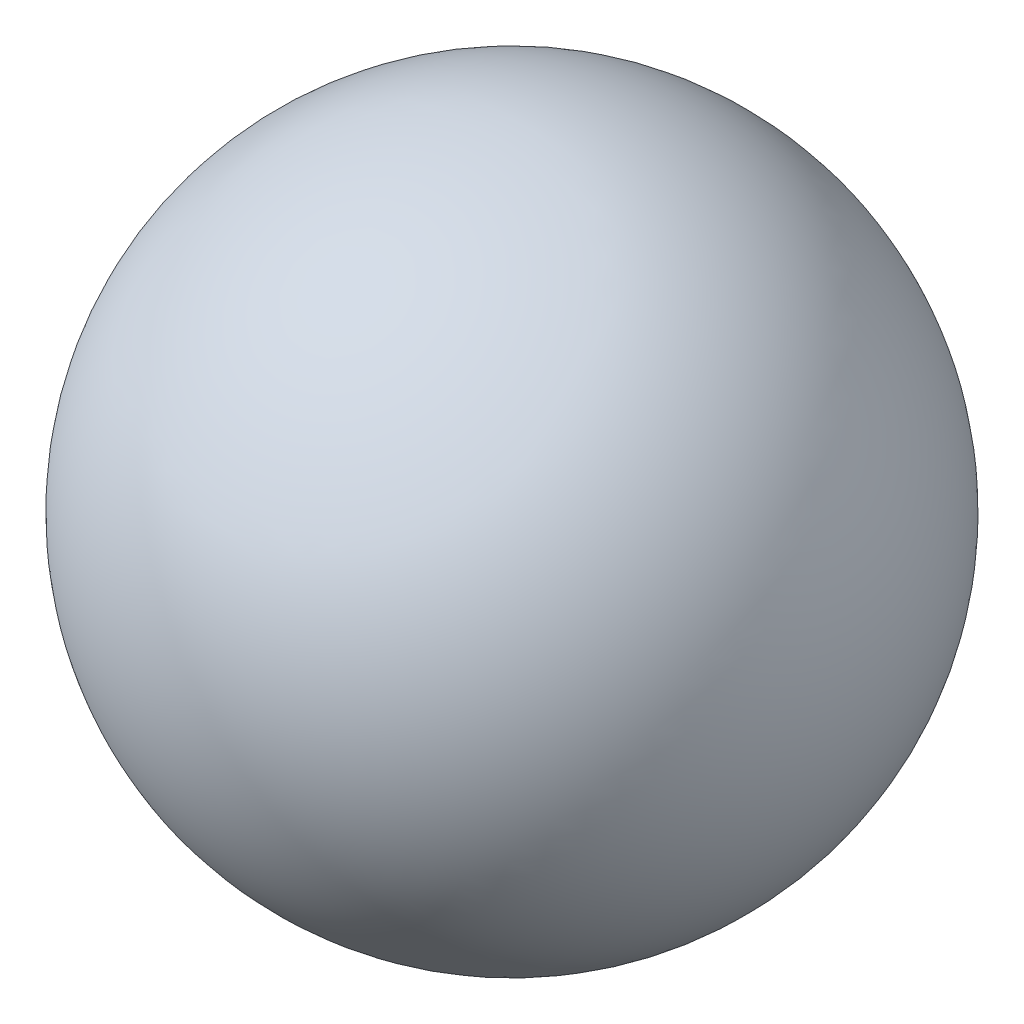
ISO-10303-21;
HEADER;
FILE_DESCRIPTION(('STEP AP214'),'2;1');
FILE_NAME('part.step','',(''),(''),'','','');
FILE_SCHEMA(('AUTOMOTIVE_DESIGN { 1 0 10303 214 1 1 1 1 }'));
ENDSEC;
DATA;
#1=APPLICATION_CONTEXT('core data for automotive mechanical design processes');
#2=APPLICATION_PROTOCOL_DEFINITION('international standard','automotive_design',2000,#1);
#3=PRODUCT_CONTEXT('',#1,'mechanical');
#4=PRODUCT('Part','Part','',(#3));
#5=PRODUCT_RELATED_PRODUCT_CATEGORY('part','',(#4));
#6=PRODUCT_DEFINITION_FORMATION('','',#4);
#7=PRODUCT_DEFINITION_CONTEXT('part definition',#1,'design');
#8=PRODUCT_DEFINITION('design','',#6,#7);
#9=PRODUCT_DEFINITION_SHAPE('','',#8);
#10=(LENGTH_UNIT() NAMED_UNIT(*) SI_UNIT(.MILLI.,.METRE.));
#11=(NAMED_UNIT(*) PLANE_ANGLE_UNIT() SI_UNIT($,.RADIAN.));
#12=(NAMED_UNIT(*) SI_UNIT($,.STERADIAN.) SOLID_ANGLE_UNIT());
#13=UNCERTAINTY_MEASURE_WITH_UNIT(LENGTH_MEASURE(1.E-05),#10,'distance_accuracy_value','');
#14=(GEOMETRIC_REPRESENTATION_CONTEXT(3) GLOBAL_UNCERTAINTY_ASSIGNED_CONTEXT((#13)) GLOBAL_UNIT_ASSIGNED_CONTEXT((#10,
#11,#12)) REPRESENTATION_CONTEXT('',''));
#15=CARTESIAN_POINT('',(0.,0.,0.));
#16=DIRECTION('',(0.,0.,1.));
#17=DIRECTION('',(1.,0.,0.));
#18=AXIS2_PLACEMENT_3D('',#15,#16,#17);
#19=CARTESIAN_POINT('',(0.,0.,-0.753424657534238));
#20=DIRECTION('',(0.,0.,-1.));
#21=DIRECTION('',(1.,0.,0.));
#22=AXIS2_PLACEMENT_3D('',#19,#20,#21);
#23=SPHERICAL_SURFACE('',#22,22.);
#24=CARTESIAN_POINT('',(0.,0.,-22.7534246575342));
#25=VERTEX_POINT('',#24);
#26=VERTEX_LOOP('',#25);
#27=FACE_BOUND('',#26,.T.);
#28=ADVANCED_FACE('F33',(#27),#23,.T.);
#29=CLOSED_SHELL('',(#28));
#30=MANIFOLD_SOLID_BREP('B2',#29);
#31=ADVANCED_BREP_SHAPE_REPRESENTATION('',(#18,#30),#14);
#32=SHAPE_DEFINITION_REPRESENTATION(#9,#31);
ENDSEC;
END-ISO-10303-21;
